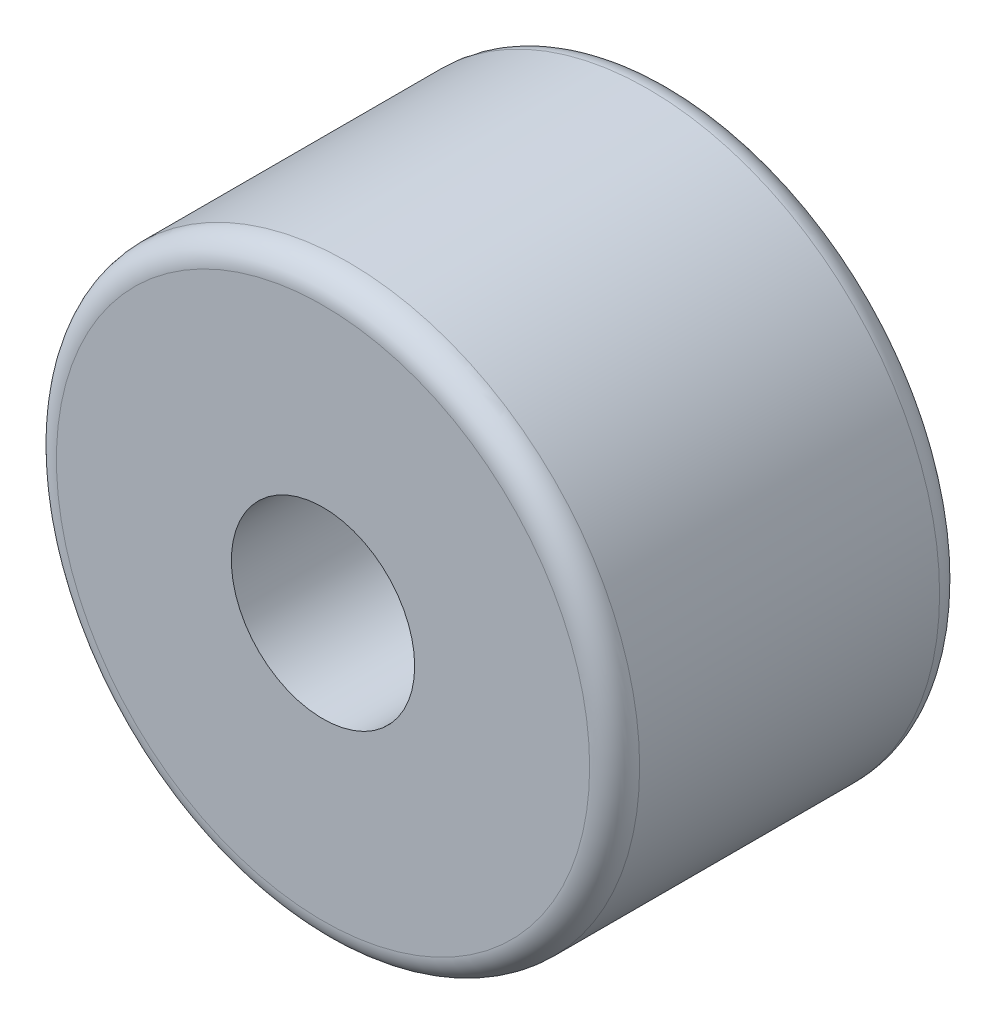
ISO-10303-21;
HEADER;
FILE_DESCRIPTION(('STEP AP214'),'2;1');
FILE_NAME('part.step','',(''),(''),'','','');
FILE_SCHEMA(('AUTOMOTIVE_DESIGN { 1 0 10303 214 1 1 1 1 }'));
ENDSEC;
DATA;
#1=APPLICATION_CONTEXT('core data for automotive mechanical design processes');
#2=APPLICATION_PROTOCOL_DEFINITION('international standard','automotive_design',2000,#1);
#3=PRODUCT_CONTEXT('',#1,'mechanical');
#4=PRODUCT('Part','Part','',(#3));
#5=PRODUCT_RELATED_PRODUCT_CATEGORY('part','',(#4));
#6=PRODUCT_DEFINITION_FORMATION('','',#4);
#7=PRODUCT_DEFINITION_CONTEXT('part definition',#1,'design');
#8=PRODUCT_DEFINITION('design','',#6,#7);
#9=PRODUCT_DEFINITION_SHAPE('','',#8);
#10=(LENGTH_UNIT() NAMED_UNIT(*) SI_UNIT(.MILLI.,.METRE.));
#11=(NAMED_UNIT(*) PLANE_ANGLE_UNIT() SI_UNIT($,.RADIAN.));
#12=(NAMED_UNIT(*) SI_UNIT($,.STERADIAN.) SOLID_ANGLE_UNIT());
#13=UNCERTAINTY_MEASURE_WITH_UNIT(LENGTH_MEASURE(1.E-05),#10,'distance_accuracy_value','');
#14=(GEOMETRIC_REPRESENTATION_CONTEXT(3) GLOBAL_UNCERTAINTY_ASSIGNED_CONTEXT((#13)) GLOBAL_UNIT_ASSIGNED_CONTEXT((#10,
#11,#12)) REPRESENTATION_CONTEXT('',''));
#15=CARTESIAN_POINT('',(0.,0.,0.));
#16=DIRECTION('',(0.,0.,1.));
#17=DIRECTION('',(1.,0.,0.));
#18=AXIS2_PLACEMENT_3D('',#15,#16,#17);
#19=CARTESIAN_POINT('',(0.,0.,42.));
#20=DIRECTION('',(0.,0.,-1.));
#21=DIRECTION('',(-1.,0.,0.));
#22=AXIS2_PLACEMENT_3D('',#19,#20,#21);
#23=CYLINDRICAL_SURFACE('',#22,35.);
#24=CARTESIAN_POINT('',(0.,0.,39.));
#25=DIRECTION('',(0.,0.,1.));
#26=DIRECTION('',(1.,0.,0.));
#27=AXIS2_PLACEMENT_3D('',#24,#25,#26);
#28=CIRCLE('',#27,35.);
#29=CARTESIAN_POINT('',(-35.,0.,39.));
#30=VERTEX_POINT('',#29);
#31=EDGE_CURVE('E40',#30,#30,#28,.F.);
#32=CARTESIAN_POINT('',(0.,0.,3.));
#33=DIRECTION('',(0.,0.,1.));
#34=DIRECTION('',(1.,0.,0.));
#35=AXIS2_PLACEMENT_3D('',#32,#33,#34);
#36=CIRCLE('',#35,35.);
#37=CARTESIAN_POINT('',(-35.,0.,3.));
#38=VERTEX_POINT('',#37);
#39=EDGE_CURVE('E44',#38,#38,#36,.T.);
#40=CARTESIAN_POINT('',(-35.,0.,39.));
#41=CARTESIAN_POINT('',(-35.,0.,38.625));
#42=CARTESIAN_POINT('',(-35.,0.,38.25));
#43=CARTESIAN_POINT('',(-35.,0.,37.5));
#44=CARTESIAN_POINT('',(-35.,0.,37.125));
#45=CARTESIAN_POINT('',(-35.,0.,36.375));
#46=CARTESIAN_POINT('',(-35.,0.,36.));
#47=CARTESIAN_POINT('',(-35.,0.,35.25));
#48=CARTESIAN_POINT('',(-35.,0.,34.875));
#49=CARTESIAN_POINT('',(-35.,0.,34.125));
#50=CARTESIAN_POINT('',(-35.,0.,33.75));
#51=CARTESIAN_POINT('',(-35.,0.,33.));
#52=CARTESIAN_POINT('',(-35.,0.,32.625));
#53=CARTESIAN_POINT('',(-35.,0.,31.875));
#54=CARTESIAN_POINT('',(-35.,0.,31.5));
#55=CARTESIAN_POINT('',(-35.,0.,30.75));
#56=CARTESIAN_POINT('',(-35.,0.,30.375));
#57=CARTESIAN_POINT('',(-35.,0.,29.625));
#58=CARTESIAN_POINT('',(-35.,0.,29.25));
#59=CARTESIAN_POINT('',(-35.,0.,28.5));
#60=CARTESIAN_POINT('',(-35.,0.,28.125));
#61=CARTESIAN_POINT('',(-35.,0.,27.375));
#62=CARTESIAN_POINT('',(-35.,0.,27.));
#63=CARTESIAN_POINT('',(-35.,0.,26.25));
#64=CARTESIAN_POINT('',(-35.,0.,25.875));
#65=CARTESIAN_POINT('',(-35.,0.,25.125));
#66=CARTESIAN_POINT('',(-35.,0.,24.75));
#67=CARTESIAN_POINT('',(-35.,0.,24.));
#68=CARTESIAN_POINT('',(-35.,0.,23.625));
#69=CARTESIAN_POINT('',(-35.,0.,22.875));
#70=CARTESIAN_POINT('',(-35.,0.,22.5));
#71=CARTESIAN_POINT('',(-35.,0.,21.75));
#72=CARTESIAN_POINT('',(-35.,0.,21.375));
#73=CARTESIAN_POINT('',(-35.,0.,20.625));
#74=CARTESIAN_POINT('',(-35.,0.,20.25));
#75=CARTESIAN_POINT('',(-35.,0.,19.5));
#76=CARTESIAN_POINT('',(-35.,0.,19.125));
#77=CARTESIAN_POINT('',(-35.,0.,18.375));
#78=CARTESIAN_POINT('',(-35.,0.,18.));
#79=CARTESIAN_POINT('',(-35.,0.,17.25));
#80=CARTESIAN_POINT('',(-35.,0.,16.875));
#81=CARTESIAN_POINT('',(-35.,0.,16.125));
#82=CARTESIAN_POINT('',(-35.,0.,15.75));
#83=CARTESIAN_POINT('',(-35.,0.,15.));
#84=CARTESIAN_POINT('',(-35.,0.,14.625));
#85=CARTESIAN_POINT('',(-35.,0.,13.875));
#86=CARTESIAN_POINT('',(-35.,0.,13.5));
#87=CARTESIAN_POINT('',(-35.,0.,12.75));
#88=CARTESIAN_POINT('',(-35.,0.,12.375));
#89=CARTESIAN_POINT('',(-35.,0.,11.625));
#90=CARTESIAN_POINT('',(-35.,0.,11.25));
#91=CARTESIAN_POINT('',(-35.,0.,10.5));
#92=CARTESIAN_POINT('',(-35.,0.,10.125));
#93=CARTESIAN_POINT('',(-35.,0.,9.375));
#94=CARTESIAN_POINT('',(-35.,0.,9.));
#95=CARTESIAN_POINT('',(-35.,0.,8.25));
#96=CARTESIAN_POINT('',(-35.,0.,7.87500000000001));
#97=CARTESIAN_POINT('',(-35.,0.,7.12500000000001));
#98=CARTESIAN_POINT('',(-35.,0.,6.75000000000001));
#99=CARTESIAN_POINT('',(-35.,0.,6.00000000000001));
#100=CARTESIAN_POINT('',(-35.,0.,5.62500000000001));
#101=CARTESIAN_POINT('',(-35.,0.,4.875));
#102=CARTESIAN_POINT('',(-35.,0.,4.5));
#103=CARTESIAN_POINT('',(-35.,0.,3.75));
#104=CARTESIAN_POINT('',(-35.,0.,3.375));
#105=CARTESIAN_POINT('',(-35.,0.,3.));
#106=B_SPLINE_CURVE_WITH_KNOTS('',3,(#40,#41,#42,#43,#44,#45,#46,#47,#48,#49,#50,#51,#52,#53,
#54,#55,#56,#57,#58,#59,#60,#61,#62,#63,#64,#65,#66,#67,#68,#69,#70,#71,#72,#73,#74,#75,#76,#77,
#78,#79,#80,#81,#82,#83,#84,#85,#86,#87,#88,#89,#90,#91,#92,#93,#94,#95,#96,#97,#98,#99,#100,
#101,#102,#103,#104,#105),.UNSPECIFIED.,.F.,.F.,(4,2,2,2,2,2,2,2,2,2,2,2,2,2,2,2,2,2,2,2,2,2,2,
2,2,2,2,2,2,2,2,2,4),(0.,1.125,2.25,3.375,4.5,5.62500000000001,6.75,7.875,9.,10.125,11.25,
12.375,13.5,14.625,15.75,16.875,18.,19.125,20.25,21.375,22.5,23.625,24.75,25.875,27.,28.125,
29.25,30.375,31.5,32.625,33.75,34.875,36.),.UNSPECIFIED.);
#107=EDGE_CURVE('BSEAM33',#30,#38,#106,.T.);
#108=ORIENTED_EDGE('',*,*,#31,.T.);
#109=ORIENTED_EDGE('',*,*,#39,.T.);
#110=ORIENTED_EDGE('',*,*,#107,.T.);
#111=ORIENTED_EDGE('',*,*,#107,.F.);
#112=EDGE_LOOP('',(#108,#110,#109,#111));
#113=FACE_BOUND('',#112,.T.);
#114=ADVANCED_FACE('F33',(#113),#23,.T.);
#115=CARTESIAN_POINT('',(0.,0.,42.));
#116=DIRECTION('',(0.,0.,1.));
#117=DIRECTION('',(1.,0.,0.));
#118=AXIS2_PLACEMENT_3D('',#115,#116,#117);
#119=PLANE('',#118);
#120=CARTESIAN_POINT('',(0.,0.,42.));
#121=DIRECTION('',(0.,0.,1.));
#122=DIRECTION('',(1.,0.,0.));
#123=AXIS2_PLACEMENT_3D('',#120,#121,#122);
#124=CIRCLE('',#123,11.);
#125=CARTESIAN_POINT('',(11.,0.,42.));
#126=VERTEX_POINT('',#125);
#127=EDGE_CURVE('E54',#126,#126,#124,.T.);
#128=ORIENTED_EDGE('',*,*,#127,.F.);
#129=EDGE_LOOP('',(#128));
#130=FACE_BOUND('',#129,.T.);
#131=CARTESIAN_POINT('',(0.,0.,42.));
#132=DIRECTION('',(0.,0.,1.));
#133=DIRECTION('',(1.,0.,0.));
#134=AXIS2_PLACEMENT_3D('',#131,#132,#133);
#135=CIRCLE('',#134,32.);
#136=CARTESIAN_POINT('',(32.,0.,42.));
#137=VERTEX_POINT('',#136);
#138=EDGE_CURVE('E48',#137,#137,#135,.T.);
#139=ORIENTED_EDGE('',*,*,#138,.T.);
#140=EDGE_LOOP('',(#139));
#141=FACE_BOUND('',#140,.T.);
#142=ADVANCED_FACE('F68',(#130,#141),#119,.T.);
#143=CARTESIAN_POINT('',(0.,0.,0.));
#144=DIRECTION('',(0.,0.,1.));
#145=DIRECTION('',(1.,0.,0.));
#146=AXIS2_PLACEMENT_3D('',#143,#144,#145);
#147=PLANE('',#146);
#148=CARTESIAN_POINT('',(0.,0.,0.));
#149=DIRECTION('',(0.,0.,1.));
#150=DIRECTION('',(1.,0.,0.));
#151=AXIS2_PLACEMENT_3D('',#148,#149,#150);
#152=CIRCLE('',#151,11.);
#153=CARTESIAN_POINT('',(11.,0.,0.));
#154=VERTEX_POINT('',#153);
#155=EDGE_CURVE('E53',#154,#154,#152,.T.);
#156=ORIENTED_EDGE('',*,*,#155,.T.);
#157=EDGE_LOOP('',(#156));
#158=FACE_BOUND('',#157,.T.);
#159=CARTESIAN_POINT('',(0.,0.,0.));
#160=DIRECTION('',(0.,0.,1.));
#161=DIRECTION('',(1.,0.,0.));
#162=AXIS2_PLACEMENT_3D('',#159,#160,#161);
#163=CIRCLE('',#162,32.);
#164=CARTESIAN_POINT('',(32.,0.,0.));
#165=VERTEX_POINT('',#164);
#166=EDGE_CURVE('E10',#165,#165,#163,.F.);
#167=ORIENTED_EDGE('',*,*,#166,.T.);
#168=EDGE_LOOP('',(#167));
#169=FACE_BOUND('',#168,.T.);
#170=ADVANCED_FACE('F60',(#158,#169),#147,.F.);
#171=CARTESIAN_POINT('',(0.,0.,39.));
#172=DIRECTION('',(0.,0.,1.));
#173=DIRECTION('',(1.,0.,0.));
#174=AXIS2_PLACEMENT_3D('',#171,#172,#173);
#175=TOROIDAL_SURFACE('',#174,32.,3.);
#176=ORIENTED_EDGE('',*,*,#31,.F.);
#177=EDGE_LOOP('',(#176));
#178=FACE_BOUND('',#177,.T.);
#179=ORIENTED_EDGE('',*,*,#138,.F.);
#180=EDGE_LOOP('',(#179));
#181=FACE_BOUND('',#180,.T.);
#182=ADVANCED_FACE('F74',(#178,#181),#175,.T.);
#183=CARTESIAN_POINT('',(0.,0.,3.));
#184=DIRECTION('',(0.,0.,1.));
#185=DIRECTION('',(1.,0.,0.));
#186=AXIS2_PLACEMENT_3D('',#183,#184,#185);
#187=TOROIDAL_SURFACE('',#186,32.,3.);
#188=ORIENTED_EDGE('',*,*,#166,.F.);
#189=EDGE_LOOP('',(#188));
#190=FACE_BOUND('',#189,.T.);
#191=ORIENTED_EDGE('',*,*,#39,.F.);
#192=EDGE_LOOP('',(#191));
#193=FACE_BOUND('',#192,.T.);
#194=ADVANCED_FACE('F35',(#190,#193),#187,.T.);
#195=CARTESIAN_POINT('',(0.,0.,0.));
#196=DIRECTION('',(0.,0.,1.));
#197=DIRECTION('',(1.,0.,0.));
#198=AXIS2_PLACEMENT_3D('',#195,#196,#197);
#199=CYLINDRICAL_SURFACE('',#198,11.);
#200=CARTESIAN_POINT('',(11.,0.,0.));
#201=CARTESIAN_POINT('',(11.,0.,0.437499999999999));
#202=CARTESIAN_POINT('',(11.,0.,0.875));
#203=CARTESIAN_POINT('',(11.,0.,1.75));
#204=CARTESIAN_POINT('',(11.,0.,2.1875));
#205=CARTESIAN_POINT('',(11.,0.,3.0625));
#206=CARTESIAN_POINT('',(11.,0.,3.5));
#207=CARTESIAN_POINT('',(11.,0.,4.375));
#208=CARTESIAN_POINT('',(11.,0.,4.8125));
#209=CARTESIAN_POINT('',(11.,0.,5.6875));
#210=CARTESIAN_POINT('',(11.,0.,6.125));
#211=CARTESIAN_POINT('',(11.,0.,7.));
#212=CARTESIAN_POINT('',(11.,0.,7.4375));
#213=CARTESIAN_POINT('',(11.,0.,8.3125));
#214=CARTESIAN_POINT('',(11.,0.,8.75));
#215=CARTESIAN_POINT('',(11.,0.,9.625));
#216=CARTESIAN_POINT('',(11.,0.,10.0625));
#217=CARTESIAN_POINT('',(11.,0.,10.9375));
#218=CARTESIAN_POINT('',(11.,0.,11.375));
#219=CARTESIAN_POINT('',(11.,0.,12.25));
#220=CARTESIAN_POINT('',(11.,0.,12.6875));
#221=CARTESIAN_POINT('',(11.,0.,13.5625));
#222=CARTESIAN_POINT('',(11.,0.,14.));
#223=CARTESIAN_POINT('',(11.,0.,14.875));
#224=CARTESIAN_POINT('',(11.,0.,15.3125));
#225=CARTESIAN_POINT('',(11.,0.,16.1875));
#226=CARTESIAN_POINT('',(11.,0.,16.625));
#227=CARTESIAN_POINT('',(11.,0.,17.5));
#228=CARTESIAN_POINT('',(11.,0.,17.9375));
#229=CARTESIAN_POINT('',(11.,0.,18.8125));
#230=CARTESIAN_POINT('',(11.,0.,19.25));
#231=CARTESIAN_POINT('',(11.,0.,20.125));
#232=CARTESIAN_POINT('',(11.,0.,20.5625));
#233=CARTESIAN_POINT('',(11.,0.,21.4375));
#234=CARTESIAN_POINT('',(11.,0.,21.875));
#235=CARTESIAN_POINT('',(11.,0.,22.75));
#236=CARTESIAN_POINT('',(11.,0.,23.1875));
#237=CARTESIAN_POINT('',(11.,0.,24.0625));
#238=CARTESIAN_POINT('',(11.,0.,24.5));
#239=CARTESIAN_POINT('',(11.,0.,25.375));
#240=CARTESIAN_POINT('',(11.,0.,25.8125));
#241=CARTESIAN_POINT('',(11.,0.,26.6875));
#242=CARTESIAN_POINT('',(11.,0.,27.125));
#243=CARTESIAN_POINT('',(11.,0.,28.));
#244=CARTESIAN_POINT('',(11.,0.,28.4375));
#245=CARTESIAN_POINT('',(11.,0.,29.3125));
#246=CARTESIAN_POINT('',(11.,0.,29.75));
#247=CARTESIAN_POINT('',(11.,0.,30.625));
#248=CARTESIAN_POINT('',(11.,0.,31.0625));
#249=CARTESIAN_POINT('',(11.,0.,31.9375));
#250=CARTESIAN_POINT('',(11.,0.,32.375));
#251=CARTESIAN_POINT('',(11.,0.,33.25));
#252=CARTESIAN_POINT('',(11.,0.,33.6875));
#253=CARTESIAN_POINT('',(11.,0.,34.5625));
#254=CARTESIAN_POINT('',(11.,0.,35.));
#255=CARTESIAN_POINT('',(11.,0.,35.875));
#256=CARTESIAN_POINT('',(11.,0.,36.3125));
#257=CARTESIAN_POINT('',(11.,0.,37.1875));
#258=CARTESIAN_POINT('',(11.,0.,37.625));
#259=CARTESIAN_POINT('',(11.,0.,38.5));
#260=CARTESIAN_POINT('',(11.,0.,38.9375));
#261=CARTESIAN_POINT('',(11.,0.,39.8125));
#262=CARTESIAN_POINT('',(11.,0.,40.25));
#263=CARTESIAN_POINT('',(11.,0.,41.125));
#264=CARTESIAN_POINT('',(11.,0.,41.5625));
#265=CARTESIAN_POINT('',(11.,0.,42.));
#266=B_SPLINE_CURVE_WITH_KNOTS('',3,(#200,#201,#202,#203,#204,#205,#206,#207,#208,#209,#210,
#211,#212,#213,#214,#215,#216,#217,#218,#219,#220,#221,#222,#223,#224,#225,#226,#227,#228,#229,
#230,#231,#232,#233,#234,#235,#236,#237,#238,#239,#240,#241,#242,#243,#244,#245,#246,#247,#248,
#249,#250,#251,#252,#253,#254,#255,#256,#257,#258,#259,#260,#261,#262,#263,#264,#265),
.UNSPECIFIED.,.F.,.F.,(4,2,2,2,2,2,2,2,2,2,2,2,2,2,2,2,2,2,2,2,2,2,2,2,2,2,2,2,2,2,2,2,4),(0.,
1.3125,2.625,3.9375,5.25,6.5625,7.875,9.1875,10.5,11.8125,13.125,14.4375,15.75,17.0625,18.375,
19.6875,21.,22.3125,23.625,24.9375,26.25,27.5625,28.875,30.1875,31.5,32.8125,34.125,35.4375,
36.75,38.0625,39.375,40.6875,42.),.UNSPECIFIED.);
#267=EDGE_CURVE('BSEAM62',#154,#126,#266,.T.);
#268=ORIENTED_EDGE('',*,*,#155,.F.);
#269=ORIENTED_EDGE('',*,*,#127,.T.);
#270=ORIENTED_EDGE('',*,*,#267,.T.);
#271=ORIENTED_EDGE('',*,*,#267,.F.);
#272=EDGE_LOOP('',(#268,#270,#269,#271));
#273=FACE_BOUND('',#272,.T.);
#274=ADVANCED_FACE('F62',(#273),#199,.F.);
#275=CLOSED_SHELL('',(#114,#142,#170,#182,#194,#274));
#276=MANIFOLD_SOLID_BREP('B2',#275);
#277=ADVANCED_BREP_SHAPE_REPRESENTATION('',(#18,#276),#14);
#278=SHAPE_DEFINITION_REPRESENTATION(#9,#277);
ENDSEC;
END-ISO-10303-21;
